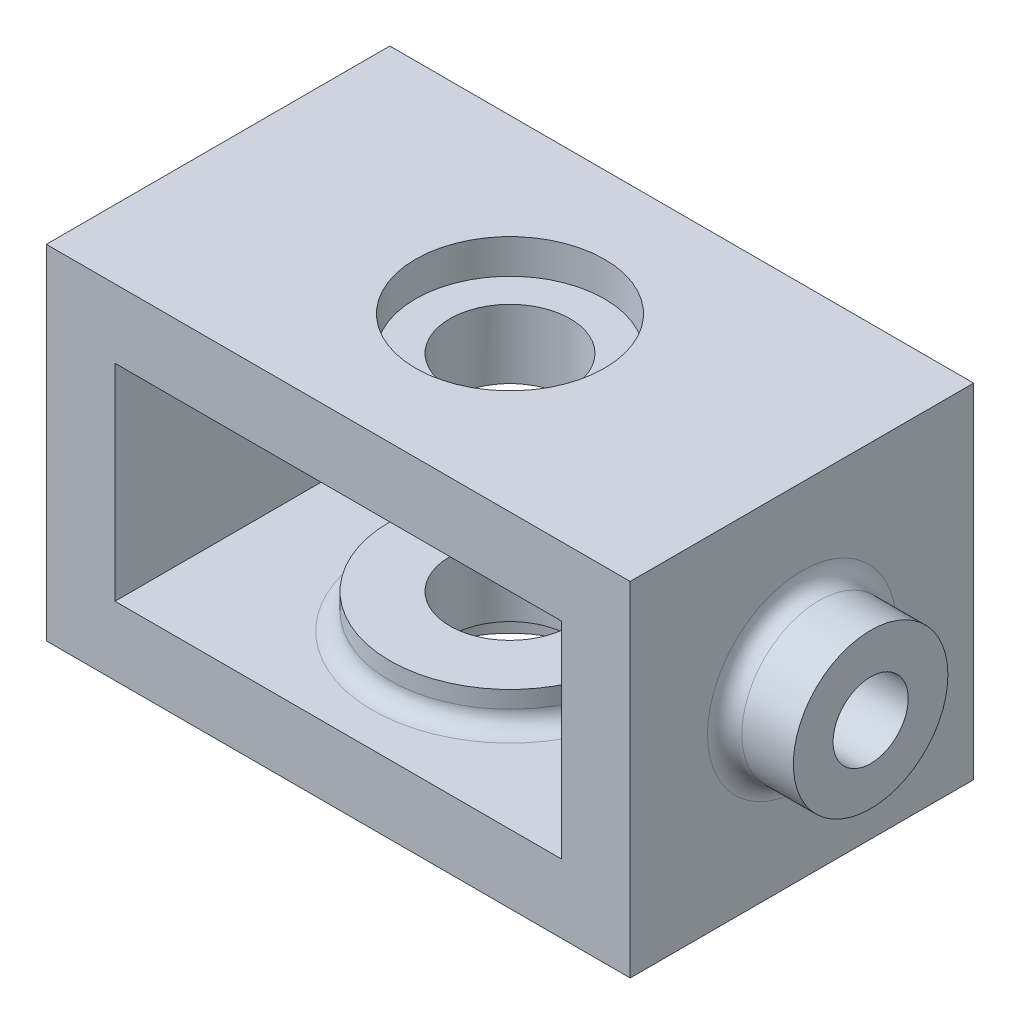
ISO-10303-21;
HEADER;
FILE_DESCRIPTION(('STEP AP214'),'2;1');
FILE_NAME('part.step','',(''),(''),'','','');
FILE_SCHEMA(('AUTOMOTIVE_DESIGN { 1 0 10303 214 1 1 1 1 }'));
ENDSEC;
DATA;
#1=APPLICATION_CONTEXT('core data for automotive mechanical design processes');
#2=APPLICATION_PROTOCOL_DEFINITION('international standard','automotive_design',2000,#1);
#3=PRODUCT_CONTEXT('',#1,'mechanical');
#4=PRODUCT('Part','Part','',(#3));
#5=PRODUCT_RELATED_PRODUCT_CATEGORY('part','',(#4));
#6=PRODUCT_DEFINITION_FORMATION('','',#4);
#7=PRODUCT_DEFINITION_CONTEXT('part definition',#1,'design');
#8=PRODUCT_DEFINITION('design','',#6,#7);
#9=PRODUCT_DEFINITION_SHAPE('','',#8);
#10=(LENGTH_UNIT() NAMED_UNIT(*) SI_UNIT(.MILLI.,.METRE.));
#11=(NAMED_UNIT(*) PLANE_ANGLE_UNIT() SI_UNIT($,.RADIAN.));
#12=(NAMED_UNIT(*) SI_UNIT($,.STERADIAN.) SOLID_ANGLE_UNIT());
#13=UNCERTAINTY_MEASURE_WITH_UNIT(LENGTH_MEASURE(1.E-05),#10,'distance_accuracy_value','');
#14=(GEOMETRIC_REPRESENTATION_CONTEXT(3) GLOBAL_UNCERTAINTY_ASSIGNED_CONTEXT((#13)) GLOBAL_UNIT_ASSIGNED_CONTEXT((#10,
#11,#12)) REPRESENTATION_CONTEXT('',''));
#15=CARTESIAN_POINT('',(0.,0.,0.));
#16=DIRECTION('',(0.,0.,1.));
#17=DIRECTION('',(1.,0.,0.));
#18=AXIS2_PLACEMENT_3D('',#15,#16,#17);
#19=CARTESIAN_POINT('',(-43.18,0.,25.4));
#20=DIRECTION('',(0.,1.,0.));
#21=DIRECTION('',(0.,0.,1.));
#22=AXIS2_PLACEMENT_3D('',#19,#20,#21);
#23=CYLINDRICAL_SURFACE('',#22,8.88999999999999);
#24=CARTESIAN_POINT('',(-43.18,5.08,25.4));
#25=DIRECTION('',(0.,-1.,0.));
#26=DIRECTION('',(0.,0.,-1.));
#27=AXIS2_PLACEMENT_3D('',#24,#25,#26);
#28=CIRCLE('',#27,8.88999999999999);
#29=CARTESIAN_POINT('',(-43.18,5.08,16.51));
#30=VERTEX_POINT('',#29);
#31=EDGE_CURVE('E224',#30,#30,#28,.F.);
#32=ORIENTED_EDGE('',*,*,#31,.F.);
#33=EDGE_LOOP('',(#32));
#34=FACE_BOUND('',#33,.T.);
#35=CARTESIAN_POINT('',(-43.18,15.24,25.4));
#36=DIRECTION('',(0.,1.,0.));
#37=DIRECTION('',(-1.,0.,0.));
#38=AXIS2_PLACEMENT_3D('',#35,#36,#37);
#39=CIRCLE('',#38,8.88999999999999);
#40=CARTESIAN_POINT('',(-52.07,15.24,25.4));
#41=VERTEX_POINT('',#40);
#42=EDGE_CURVE('E234',#41,#41,#39,.T.);
#43=ORIENTED_EDGE('',*,*,#42,.T.);
#44=EDGE_LOOP('',(#43));
#45=FACE_BOUND('',#44,.T.);
#46=ADVANCED_FACE('F39',(#34,#45),#23,.F.);
#47=CARTESIAN_POINT('',(-86.36,25.4,25.4));
#48=DIRECTION('',(1.,0.,0.));
#49=DIRECTION('',(0.,0.,-1.));
#50=AXIS2_PLACEMENT_3D('',#47,#48,#49);
#51=CYLINDRICAL_SURFACE('',#50,5.55625);
#52=CARTESIAN_POINT('',(10.16,25.4,25.4));
#53=DIRECTION('',(1.,0.,0.));
#54=DIRECTION('',(0.,0.,-1.));
#55=AXIS2_PLACEMENT_3D('',#52,#53,#54);
#56=CIRCLE('',#55,5.55625);
#57=CARTESIAN_POINT('',(10.16,25.4,19.84375));
#58=VERTEX_POINT('',#57);
#59=EDGE_CURVE('E167',#58,#58,#56,.T.);
#60=ORIENTED_EDGE('',*,*,#59,.T.);
#61=EDGE_LOOP('',(#60));
#62=FACE_BOUND('',#61,.T.);
#63=CARTESIAN_POINT('',(-10.16,25.4,25.4));
#64=DIRECTION('',(-1.,0.,0.));
#65=DIRECTION('',(0.,-1.,0.));
#66=AXIS2_PLACEMENT_3D('',#63,#64,#65);
#67=CIRCLE('',#66,5.55625);
#68=CARTESIAN_POINT('',(-10.16,19.84375,25.4));
#69=VERTEX_POINT('',#68);
#70=EDGE_CURVE('E152',#69,#69,#67,.F.);
#71=ORIENTED_EDGE('',*,*,#70,.F.);
#72=EDGE_LOOP('',(#71));
#73=FACE_BOUND('',#72,.T.);
#74=ADVANCED_FACE('F274',(#62,#73),#51,.F.);
#75=CARTESIAN_POINT('',(-86.36,0.,50.8));
#76=DIRECTION('',(0.,1.,0.));
#77=DIRECTION('',(0.,0.,1.));
#78=AXIS2_PLACEMENT_3D('',#75,#76,#77);
#79=PLANE('',#78);
#80=CARTESIAN_POINT('',(-43.18,0.,25.4));
#81=DIRECTION('',(0.,-1.,0.));
#82=DIRECTION('',(0.,0.,-1.));
#83=AXIS2_PLACEMENT_3D('',#80,#81,#82);
#84=CIRCLE('',#83,13.97);
#85=CARTESIAN_POINT('',(-43.18,0.,11.43));
#86=VERTEX_POINT('',#85);
#87=EDGE_CURVE('E323',#86,#86,#84,.T.);
#88=ORIENTED_EDGE('',*,*,#87,.F.);
#89=EDGE_LOOP('',(#88));
#90=FACE_BOUND('',#89,.T.);
#91=DIRECTION('',(1.,0.,0.));
#92=VECTOR('',#91,1.);
#93=CARTESIAN_POINT('',(-86.36,0.,0.));
#94=LINE('',#93,#92);
#95=CARTESIAN_POINT('',(-86.36,0.,0.));
#96=VERTEX_POINT('',#95);
#97=CARTESIAN_POINT('',(0.,0.,0.));
#98=VERTEX_POINT('',#97);
#99=EDGE_CURVE('E175',#96,#98,#94,.T.);
#100=ORIENTED_EDGE('',*,*,#99,.T.);
#101=DIRECTION('',(0.,0.,-1.));
#102=VECTOR('',#101,1.);
#103=CARTESIAN_POINT('',(0.,0.,50.8));
#104=LINE('',#103,#102);
#105=CARTESIAN_POINT('',(0.,0.,50.8));
#106=VERTEX_POINT('',#105);
#107=EDGE_CURVE('E214',#106,#98,#104,.T.);
#108=ORIENTED_EDGE('',*,*,#107,.F.);
#109=DIRECTION('',(1.,0.,0.));
#110=VECTOR('',#109,1.);
#111=CARTESIAN_POINT('',(-86.36,0.,50.8));
#112=LINE('',#111,#110);
#113=CARTESIAN_POINT('',(-86.36,0.,50.8));
#114=VERTEX_POINT('',#113);
#115=EDGE_CURVE('E176',#114,#106,#112,.T.);
#116=ORIENTED_EDGE('',*,*,#115,.F.);
#117=DIRECTION('',(0.,0.,-1.));
#118=VECTOR('',#117,1.);
#119=CARTESIAN_POINT('',(-86.36,0.,50.8));
#120=LINE('',#119,#118);
#121=EDGE_CURVE('E191',#114,#96,#120,.T.);
#122=ORIENTED_EDGE('',*,*,#121,.T.);
#123=EDGE_LOOP('',(#100,#108,#116,#122));
#124=FACE_BOUND('',#123,.T.);
#125=ADVANCED_FACE('F281',(#90,#124),#79,.F.);
#126=CARTESIAN_POINT('',(0.,50.8,50.8));
#127=DIRECTION('',(1.,0.,0.));
#128=DIRECTION('',(0.,0.,-1.));
#129=AXIS2_PLACEMENT_3D('',#126,#127,#128);
#130=PLANE('',#129);
#131=CARTESIAN_POINT('',(0.,25.4940503239926,25.4));
#132=DIRECTION('',(1.,0.,0.));
#133=DIRECTION('',(0.,0.,-1.));
#134=AXIS2_PLACEMENT_3D('',#131,#132,#133);
#135=CIRCLE('',#134,13.97);
#136=CARTESIAN_POINT('',(0.,25.4940503239926,11.43));
#137=VERTEX_POINT('',#136);
#138=EDGE_CURVE('E254',#137,#137,#135,.F.);
#139=ORIENTED_EDGE('',*,*,#138,.T.);
#140=EDGE_LOOP('',(#139));
#141=FACE_BOUND('',#140,.T.);
#142=DIRECTION('',(0.,-1.,0.));
#143=VECTOR('',#142,1.);
#144=CARTESIAN_POINT('',(0.,50.8,0.));
#145=LINE('',#144,#143);
#146=CARTESIAN_POINT('',(0.,50.8,0.));
#147=VERTEX_POINT('',#146);
#148=EDGE_CURVE('E195',#147,#98,#145,.T.);
#149=ORIENTED_EDGE('',*,*,#148,.F.);
#150=DIRECTION('',(0.,0.,-1.));
#151=VECTOR('',#150,1.);
#152=CARTESIAN_POINT('',(0.,50.8,50.8));
#153=LINE('',#152,#151);
#154=CARTESIAN_POINT('',(0.,50.8,50.8));
#155=VERTEX_POINT('',#154);
#156=EDGE_CURVE('E211',#155,#147,#153,.T.);
#157=ORIENTED_EDGE('',*,*,#156,.F.);
#158=DIRECTION('',(0.,-1.,0.));
#159=VECTOR('',#158,1.);
#160=CARTESIAN_POINT('',(0.,50.8,50.8));
#161=LINE('',#160,#159);
#162=EDGE_CURVE('E179',#155,#106,#161,.T.);
#163=ORIENTED_EDGE('',*,*,#162,.T.);
#164=ORIENTED_EDGE('',*,*,#107,.T.);
#165=EDGE_LOOP('',(#149,#157,#163,#164));
#166=FACE_BOUND('',#165,.T.);
#167=ADVANCED_FACE('F348',(#141,#166),#130,.T.);
#168=CARTESIAN_POINT('',(-86.36,50.8,50.8));
#169=DIRECTION('',(0.,1.,0.));
#170=DIRECTION('',(0.,0.,1.));
#171=AXIS2_PLACEMENT_3D('',#168,#169,#170);
#172=PLANE('',#171);
#173=CARTESIAN_POINT('',(-43.18,50.8,25.4));
#174=DIRECTION('',(0.,1.,0.));
#175=DIRECTION('',(0.,0.,1.));
#176=AXIS2_PLACEMENT_3D('',#173,#174,#175);
#177=CIRCLE('',#176,13.97);
#178=CARTESIAN_POINT('',(-43.18,50.8,39.37));
#179=VERTEX_POINT('',#178);
#180=EDGE_CURVE('E133',#179,#179,#177,.T.);
#181=ORIENTED_EDGE('',*,*,#180,.F.);
#182=EDGE_LOOP('',(#181));
#183=FACE_BOUND('',#182,.T.);
#184=DIRECTION('',(1.,0.,0.));
#185=VECTOR('',#184,1.);
#186=CARTESIAN_POINT('',(-86.36,50.8,0.));
#187=LINE('',#186,#185);
#188=CARTESIAN_POINT('',(-86.36,50.8,0.));
#189=VERTEX_POINT('',#188);
#190=EDGE_CURVE('E199',#189,#147,#187,.T.);
#191=ORIENTED_EDGE('',*,*,#190,.F.);
#192=DIRECTION('',(0.,0.,-1.));
#193=VECTOR('',#192,1.);
#194=CARTESIAN_POINT('',(-86.36,50.8,50.8));
#195=LINE('',#194,#193);
#196=CARTESIAN_POINT('',(-86.36,50.8,50.8));
#197=VERTEX_POINT('',#196);
#198=EDGE_CURVE('E208',#197,#189,#195,.T.);
#199=ORIENTED_EDGE('',*,*,#198,.F.);
#200=DIRECTION('',(1.,0.,0.));
#201=VECTOR('',#200,1.);
#202=CARTESIAN_POINT('',(-86.36,50.8,50.8));
#203=LINE('',#202,#201);
#204=EDGE_CURVE('E184',#197,#155,#203,.T.);
#205=ORIENTED_EDGE('',*,*,#204,.T.);
#206=ORIENTED_EDGE('',*,*,#156,.T.);
#207=EDGE_LOOP('',(#191,#199,#205,#206));
#208=FACE_BOUND('',#207,.T.);
#209=ADVANCED_FACE('F344',(#183,#208),#172,.T.);
#210=CARTESIAN_POINT('',(-86.36,50.8,50.8));
#211=DIRECTION('',(1.,0.,0.));
#212=DIRECTION('',(0.,0.,-1.));
#213=AXIS2_PLACEMENT_3D('',#210,#211,#212);
#214=PLANE('',#213);
#215=CARTESIAN_POINT('',(-86.36,25.4,25.4));
#216=DIRECTION('',(1.,0.,0.));
#217=DIRECTION('',(0.,0.,-1.));
#218=AXIS2_PLACEMENT_3D('',#215,#216,#217);
#219=CIRCLE('',#218,13.97);
#220=CARTESIAN_POINT('',(-86.36,25.4,11.43));
#221=VERTEX_POINT('',#220);
#222=EDGE_CURVE('E238',#221,#221,#219,.T.);
#223=ORIENTED_EDGE('',*,*,#222,.T.);
#224=EDGE_LOOP('',(#223));
#225=FACE_BOUND('',#224,.T.);
#226=DIRECTION('',(0.,-1.,0.));
#227=VECTOR('',#226,1.);
#228=CARTESIAN_POINT('',(-86.36,50.8,0.));
#229=LINE('',#228,#227);
#230=EDGE_CURVE('E180',#189,#96,#229,.T.);
#231=ORIENTED_EDGE('',*,*,#230,.T.);
#232=ORIENTED_EDGE('',*,*,#121,.F.);
#233=DIRECTION('',(0.,-1.,0.));
#234=VECTOR('',#233,1.);
#235=CARTESIAN_POINT('',(-86.36,50.8,50.8));
#236=LINE('',#235,#234);
#237=EDGE_CURVE('E188',#197,#114,#236,.T.);
#238=ORIENTED_EDGE('',*,*,#237,.F.);
#239=ORIENTED_EDGE('',*,*,#198,.T.);
#240=EDGE_LOOP('',(#231,#232,#238,#239));
#241=FACE_BOUND('',#240,.T.);
#242=ADVANCED_FACE('F347',(#225,#241),#214,.F.);
#243=CARTESIAN_POINT('',(0.,0.,50.8));
#244=DIRECTION('',(0.,0.,-1.));
#245=DIRECTION('',(-1.,0.,0.));
#246=AXIS2_PLACEMENT_3D('',#243,#244,#245);
#247=PLANE('',#246);
#248=DIRECTION('',(0.,-1.,0.));
#249=VECTOR('',#248,1.);
#250=CARTESIAN_POINT('',(-10.16,40.64,50.8));
#251=LINE('',#250,#249);
#252=CARTESIAN_POINT('',(-10.16,40.64,50.8));
#253=VERTEX_POINT('',#252);
#254=CARTESIAN_POINT('',(-10.16,10.16,50.8));
#255=VERTEX_POINT('',#254);
#256=EDGE_CURVE('E142',#253,#255,#251,.T.);
#257=ORIENTED_EDGE('',*,*,#256,.T.);
#258=DIRECTION('',(1.,0.,0.));
#259=VECTOR('',#258,1.);
#260=CARTESIAN_POINT('',(-76.2,10.16,50.8));
#261=LINE('',#260,#259);
#262=CARTESIAN_POINT('',(-76.2,10.16,50.8));
#263=VERTEX_POINT('',#262);
#264=EDGE_CURVE('E55',#263,#255,#261,.T.);
#265=ORIENTED_EDGE('',*,*,#264,.F.);
#266=DIRECTION('',(0.,-1.,0.));
#267=VECTOR('',#266,1.);
#268=CARTESIAN_POINT('',(-76.2,40.64,50.8));
#269=LINE('',#268,#267);
#270=CARTESIAN_POINT('',(-76.2,40.64,50.8));
#271=VERTEX_POINT('',#270);
#272=EDGE_CURVE('E126',#271,#263,#269,.T.);
#273=ORIENTED_EDGE('',*,*,#272,.F.);
#274=DIRECTION('',(1.,0.,0.));
#275=VECTOR('',#274,1.);
#276=CARTESIAN_POINT('',(-76.2,40.64,50.8));
#277=LINE('',#276,#275);
#278=EDGE_CURVE('E130',#271,#253,#277,.T.);
#279=ORIENTED_EDGE('',*,*,#278,.T.);
#280=EDGE_LOOP('',(#257,#265,#273,#279));
#281=FACE_BOUND('',#280,.T.);
#282=ORIENTED_EDGE('',*,*,#115,.T.);
#283=ORIENTED_EDGE('',*,*,#162,.F.);
#284=ORIENTED_EDGE('',*,*,#204,.F.);
#285=ORIENTED_EDGE('',*,*,#237,.T.);
#286=EDGE_LOOP('',(#282,#283,#284,#285));
#287=FACE_BOUND('',#286,.T.);
#288=ADVANCED_FACE('F362',(#281,#287),#247,.F.);
#289=CARTESIAN_POINT('',(0.,0.,0.));
#290=DIRECTION('',(0.,0.,-1.));
#291=DIRECTION('',(-1.,0.,0.));
#292=AXIS2_PLACEMENT_3D('',#289,#290,#291);
#293=PLANE('',#292);
#294=DIRECTION('',(1.,0.,0.));
#295=VECTOR('',#294,1.);
#296=CARTESIAN_POINT('',(-76.2,10.16,0.));
#297=LINE('',#296,#295);
#298=CARTESIAN_POINT('',(-76.2,10.16,0.));
#299=VERTEX_POINT('',#298);
#300=CARTESIAN_POINT('',(-10.16,10.16,0.));
#301=VERTEX_POINT('',#300);
#302=EDGE_CURVE('E114',#299,#301,#297,.T.);
#303=ORIENTED_EDGE('',*,*,#302,.T.);
#304=DIRECTION('',(0.,-1.,0.));
#305=VECTOR('',#304,1.);
#306=CARTESIAN_POINT('',(-10.16,40.64,0.));
#307=LINE('',#306,#305);
#308=CARTESIAN_POINT('',(-10.16,40.64,0.));
#309=VERTEX_POINT('',#308);
#310=EDGE_CURVE('E104',#309,#301,#307,.T.);
#311=ORIENTED_EDGE('',*,*,#310,.F.);
#312=DIRECTION('',(1.,0.,0.));
#313=VECTOR('',#312,1.);
#314=CARTESIAN_POINT('',(-76.2,40.64,0.));
#315=LINE('',#314,#313);
#316=CARTESIAN_POINT('',(-76.2,40.64,0.));
#317=VERTEX_POINT('',#316);
#318=EDGE_CURVE('E113',#317,#309,#315,.T.);
#319=ORIENTED_EDGE('',*,*,#318,.F.);
#320=DIRECTION('',(0.,-1.,0.));
#321=VECTOR('',#320,1.);
#322=CARTESIAN_POINT('',(-76.2,40.64,0.));
#323=LINE('',#322,#321);
#324=EDGE_CURVE('E120',#317,#299,#323,.T.);
#325=ORIENTED_EDGE('',*,*,#324,.T.);
#326=EDGE_LOOP('',(#303,#311,#319,#325));
#327=FACE_BOUND('',#326,.T.);
#328=ORIENTED_EDGE('',*,*,#99,.F.);
#329=ORIENTED_EDGE('',*,*,#230,.F.);
#330=ORIENTED_EDGE('',*,*,#190,.T.);
#331=ORIENTED_EDGE('',*,*,#148,.T.);
#332=EDGE_LOOP('',(#328,#329,#330,#331));
#333=FACE_BOUND('',#332,.T.);
#334=ADVANCED_FACE('F122',(#327,#333),#293,.T.);
#335=CARTESIAN_POINT('',(-76.2,25.4,25.4));
#336=DIRECTION('',(-1.,0.,0.));
#337=DIRECTION('',(0.,0.,1.));
#338=AXIS2_PLACEMENT_3D('',#335,#336,#337);
#339=CIRCLE('',#338,5.55625);
#340=CARTESIAN_POINT('',(-76.2,25.4,30.95625));
#341=VERTEX_POINT('',#340);
#342=EDGE_CURVE('E163',#341,#341,#339,.F.);
#343=ORIENTED_EDGE('',*,*,#342,.T.);
#344=EDGE_LOOP('',(#343));
#345=FACE_BOUND('',#344,.T.);
#346=CARTESIAN_POINT('',(-96.52,25.4,25.4));
#347=DIRECTION('',(-1.,0.,0.));
#348=DIRECTION('',(0.,0.,1.));
#349=AXIS2_PLACEMENT_3D('',#346,#347,#348);
#350=CIRCLE('',#349,5.55625);
#351=CARTESIAN_POINT('',(-96.52,25.4,30.95625));
#352=VERTEX_POINT('',#351);
#353=EDGE_CURVE('E158',#352,#352,#350,.T.);
#354=ORIENTED_EDGE('',*,*,#353,.T.);
#355=EDGE_LOOP('',(#354));
#356=FACE_BOUND('',#355,.T.);
#357=ADVANCED_FACE('F284',(#345,#356),#51,.F.);
#358=CARTESIAN_POINT('',(10.16,25.4940503239926,25.4));
#359=DIRECTION('',(-1.,0.,0.));
#360=DIRECTION('',(0.,0.,1.));
#361=AXIS2_PLACEMENT_3D('',#358,#359,#360);
#362=CYLINDRICAL_SURFACE('',#361,11.43);
#363=CARTESIAN_POINT('',(2.54,25.4940503239926,25.4));
#364=DIRECTION('',(1.,0.,0.));
#365=DIRECTION('',(0.,0.,-1.));
#366=AXIS2_PLACEMENT_3D('',#363,#364,#365);
#367=CIRCLE('',#366,11.43);
#368=CARTESIAN_POINT('',(2.54,25.4940503239926,13.97));
#369=VERTEX_POINT('',#368);
#370=EDGE_CURVE('E250',#369,#369,#367,.T.);
#371=ORIENTED_EDGE('',*,*,#370,.T.);
#372=EDGE_LOOP('',(#371));
#373=FACE_BOUND('',#372,.T.);
#374=CARTESIAN_POINT('',(10.16,25.4940503239926,25.4));
#375=DIRECTION('',(1.,0.,0.));
#376=DIRECTION('',(0.,0.,-1.));
#377=AXIS2_PLACEMENT_3D('',#374,#375,#376);
#378=CIRCLE('',#377,11.43);
#379=CARTESIAN_POINT('',(10.16,25.4940503239926,13.97));
#380=VERTEX_POINT('',#379);
#381=EDGE_CURVE('E171',#380,#380,#378,.T.);
#382=ORIENTED_EDGE('',*,*,#381,.F.);
#383=EDGE_LOOP('',(#382));
#384=FACE_BOUND('',#383,.T.);
#385=ADVANCED_FACE('F473',(#373,#384),#362,.T.);
#386=CARTESIAN_POINT('',(10.16,25.4940503239926,25.4));
#387=DIRECTION('',(1.,0.,0.));
#388=DIRECTION('',(0.,0.,-1.));
#389=AXIS2_PLACEMENT_3D('',#386,#387,#388);
#390=PLANE('',#389);
#391=ORIENTED_EDGE('',*,*,#59,.F.);
#392=EDGE_LOOP('',(#391));
#393=FACE_BOUND('',#392,.T.);
#394=ORIENTED_EDGE('',*,*,#381,.T.);
#395=EDGE_LOOP('',(#394));
#396=FACE_BOUND('',#395,.T.);
#397=ADVANCED_FACE('F478',(#393,#396),#390,.T.);
#398=CARTESIAN_POINT('',(-96.52,25.4,25.4));
#399=DIRECTION('',(1.,0.,0.));
#400=DIRECTION('',(0.,0.,-1.));
#401=AXIS2_PLACEMENT_3D('',#398,#399,#400);
#402=CYLINDRICAL_SURFACE('',#401,11.43);
#403=CARTESIAN_POINT('',(-88.9,25.4,25.4));
#404=DIRECTION('',(1.,0.,0.));
#405=DIRECTION('',(0.,0.,-1.));
#406=AXIS2_PLACEMENT_3D('',#403,#404,#405);
#407=CIRCLE('',#406,11.43);
#408=CARTESIAN_POINT('',(-88.9,25.4,13.97));
#409=VERTEX_POINT('',#408);
#410=EDGE_CURVE('E217',#409,#409,#407,.F.);
#411=ORIENTED_EDGE('',*,*,#410,.T.);
#412=EDGE_LOOP('',(#411));
#413=FACE_BOUND('',#412,.T.);
#414=CARTESIAN_POINT('',(-96.52,25.4,25.4));
#415=DIRECTION('',(-1.,0.,0.));
#416=DIRECTION('',(0.,0.,1.));
#417=AXIS2_PLACEMENT_3D('',#414,#415,#416);
#418=CIRCLE('',#417,11.43);
#419=CARTESIAN_POINT('',(-96.52,25.4,36.83));
#420=VERTEX_POINT('',#419);
#421=EDGE_CURVE('E162',#420,#420,#418,.T.);
#422=ORIENTED_EDGE('',*,*,#421,.F.);
#423=EDGE_LOOP('',(#422));
#424=FACE_BOUND('',#423,.T.);
#425=ADVANCED_FACE('F488',(#413,#424),#402,.T.);
#426=CARTESIAN_POINT('',(-96.52,25.4,25.4));
#427=DIRECTION('',(-1.,0.,0.));
#428=DIRECTION('',(0.,0.,1.));
#429=AXIS2_PLACEMENT_3D('',#426,#427,#428);
#430=PLANE('',#429);
#431=ORIENTED_EDGE('',*,*,#353,.F.);
#432=EDGE_LOOP('',(#431));
#433=FACE_BOUND('',#432,.T.);
#434=ORIENTED_EDGE('',*,*,#421,.T.);
#435=EDGE_LOOP('',(#434));
#436=FACE_BOUND('',#435,.T.);
#437=ADVANCED_FACE('F492',(#433,#436),#430,.T.);
#438=CARTESIAN_POINT('',(-76.2,40.64,0.));
#439=DIRECTION('',(-1.,0.,0.));
#440=DIRECTION('',(0.,0.,1.));
#441=AXIS2_PLACEMENT_3D('',#438,#439,#440);
#442=PLANE('',#441);
#443=ORIENTED_EDGE('',*,*,#272,.T.);
#444=DIRECTION('',(0.,0.,1.));
#445=VECTOR('',#444,1.);
#446=CARTESIAN_POINT('',(-76.2,10.16,0.));
#447=LINE('',#446,#445);
#448=EDGE_CURVE('E149',#299,#263,#447,.T.);
#449=ORIENTED_EDGE('',*,*,#448,.F.);
#450=ORIENTED_EDGE('',*,*,#324,.F.);
#451=DIRECTION('',(0.,0.,1.));
#452=VECTOR('',#451,1.);
#453=CARTESIAN_POINT('',(-76.2,40.64,0.));
#454=LINE('',#453,#452);
#455=EDGE_CURVE('E153',#317,#271,#454,.T.);
#456=ORIENTED_EDGE('',*,*,#455,.T.);
#457=EDGE_LOOP('',(#443,#449,#450,#456));
#458=FACE_BOUND('',#457,.T.);
#459=ORIENTED_EDGE('',*,*,#342,.F.);
#460=EDGE_LOOP('',(#459));
#461=FACE_BOUND('',#460,.T.);
#462=ADVANCED_FACE('F591',(#458,#461),#442,.F.);
#463=CARTESIAN_POINT('',(-10.16,40.64,0.));
#464=DIRECTION('',(-1.,0.,0.));
#465=DIRECTION('',(0.,-1.,0.));
#466=AXIS2_PLACEMENT_3D('',#463,#464,#465);
#467=PLANE('',#466);
#468=ORIENTED_EDGE('',*,*,#256,.F.);
#469=DIRECTION('',(0.,0.,1.));
#470=VECTOR('',#469,1.);
#471=CARTESIAN_POINT('',(-10.16,40.64,0.));
#472=LINE('',#471,#470);
#473=EDGE_CURVE('E63',#309,#253,#472,.T.);
#474=ORIENTED_EDGE('',*,*,#473,.F.);
#475=ORIENTED_EDGE('',*,*,#310,.T.);
#476=DIRECTION('',(0.,0.,1.));
#477=VECTOR('',#476,1.);
#478=CARTESIAN_POINT('',(-10.16,10.16,0.));
#479=LINE('',#478,#477);
#480=EDGE_CURVE('E107',#301,#255,#479,.T.);
#481=ORIENTED_EDGE('',*,*,#480,.T.);
#482=EDGE_LOOP('',(#468,#474,#475,#481));
#483=FACE_BOUND('',#482,.T.);
#484=ORIENTED_EDGE('',*,*,#70,.T.);
#485=EDGE_LOOP('',(#484));
#486=FACE_BOUND('',#485,.T.);
#487=ADVANCED_FACE('F105',(#483,#486),#467,.T.);
#488=CARTESIAN_POINT('',(-76.2,10.16,0.));
#489=DIRECTION('',(0.,-1.,0.));
#490=DIRECTION('',(1.,0.,0.));
#491=AXIS2_PLACEMENT_3D('',#488,#489,#490);
#492=PLANE('',#491);
#493=CARTESIAN_POINT('',(-43.18,10.16,25.4));
#494=DIRECTION('',(0.,-1.,0.));
#495=DIRECTION('',(1.,0.,0.));
#496=AXIS2_PLACEMENT_3D('',#493,#494,#495);
#497=CIRCLE('',#496,20.32);
#498=CARTESIAN_POINT('',(-22.86,10.16,25.4));
#499=VERTEX_POINT('',#498);
#500=EDGE_CURVE('E11',#499,#499,#497,.T.);
#501=ORIENTED_EDGE('',*,*,#500,.T.);
#502=EDGE_LOOP('',(#501));
#503=FACE_BOUND('',#502,.T.);
#504=ORIENTED_EDGE('',*,*,#264,.T.);
#505=ORIENTED_EDGE('',*,*,#480,.F.);
#506=ORIENTED_EDGE('',*,*,#302,.F.);
#507=ORIENTED_EDGE('',*,*,#448,.T.);
#508=EDGE_LOOP('',(#504,#505,#506,#507));
#509=FACE_BOUND('',#508,.T.);
#510=ADVANCED_FACE('F117',(#503,#509),#492,.F.);
#511=CARTESIAN_POINT('',(-76.2,40.64,0.));
#512=DIRECTION('',(0.,-1.,0.));
#513=DIRECTION('',(0.,0.,-1.));
#514=AXIS2_PLACEMENT_3D('',#511,#512,#513);
#515=PLANE('',#514);
#516=CARTESIAN_POINT('',(-43.18,40.64,25.4));
#517=DIRECTION('',(0.,-1.,0.));
#518=DIRECTION('',(0.,0.,-1.));
#519=AXIS2_PLACEMENT_3D('',#516,#517,#518);
#520=CIRCLE('',#519,20.32);
#521=CARTESIAN_POINT('',(-43.18,40.64,5.08));
#522=VERTEX_POINT('',#521);
#523=EDGE_CURVE('E246',#522,#522,#520,.F.);
#524=ORIENTED_EDGE('',*,*,#523,.T.);
#525=EDGE_LOOP('',(#524));
#526=FACE_BOUND('',#525,.T.);
#527=ORIENTED_EDGE('',*,*,#278,.F.);
#528=ORIENTED_EDGE('',*,*,#455,.F.);
#529=ORIENTED_EDGE('',*,*,#318,.T.);
#530=ORIENTED_EDGE('',*,*,#473,.T.);
#531=EDGE_LOOP('',(#527,#528,#529,#530));
#532=FACE_BOUND('',#531,.T.);
#533=ADVANCED_FACE('F421',(#526,#532),#515,.T.);
#534=CARTESIAN_POINT('',(-43.18,45.72,25.4));
#535=DIRECTION('',(0.,1.,0.));
#536=DIRECTION('',(0.,0.,1.));
#537=AXIS2_PLACEMENT_3D('',#534,#535,#536);
#538=CYLINDRICAL_SURFACE('',#537,13.97);
#539=CARTESIAN_POINT('',(-43.18,45.72,25.4));
#540=DIRECTION('',(0.,1.,0.));
#541=DIRECTION('',(0.,0.,1.));
#542=AXIS2_PLACEMENT_3D('',#539,#540,#541);
#543=CIRCLE('',#542,13.97);
#544=CARTESIAN_POINT('',(-43.18,45.72,39.37));
#545=VERTEX_POINT('',#544);
#546=EDGE_CURVE('E143',#545,#545,#543,.T.);
#547=ORIENTED_EDGE('',*,*,#546,.F.);
#548=EDGE_LOOP('',(#547));
#549=FACE_BOUND('',#548,.T.);
#550=ORIENTED_EDGE('',*,*,#180,.T.);
#551=EDGE_LOOP('',(#550));
#552=FACE_BOUND('',#551,.T.);
#553=ADVANCED_FACE('F300',(#549,#552),#538,.F.);
#554=CARTESIAN_POINT('',(-43.18,45.72,25.4));
#555=DIRECTION('',(0.,1.,0.));
#556=DIRECTION('',(0.,0.,1.));
#557=AXIS2_PLACEMENT_3D('',#554,#555,#556);
#558=PLANE('',#557);
#559=CARTESIAN_POINT('',(-43.18,45.72,25.4));
#560=DIRECTION('',(0.,1.,0.));
#561=DIRECTION('',(0.,0.,1.));
#562=AXIS2_PLACEMENT_3D('',#559,#560,#561);
#563=CIRCLE('',#562,8.88999999999999);
#564=CARTESIAN_POINT('',(-43.18,45.72,34.29));
#565=VERTEX_POINT('',#564);
#566=EDGE_CURVE('E228',#565,#565,#563,.T.);
#567=ORIENTED_EDGE('',*,*,#566,.F.);
#568=EDGE_LOOP('',(#567));
#569=FACE_BOUND('',#568,.T.);
#570=ORIENTED_EDGE('',*,*,#546,.T.);
#571=EDGE_LOOP('',(#570));
#572=FACE_BOUND('',#571,.T.);
#573=ADVANCED_FACE('F291',(#569,#572),#558,.T.);
#574=ORIENTED_EDGE('',*,*,#566,.T.);
#575=EDGE_LOOP('',(#574));
#576=FACE_BOUND('',#575,.T.);
#577=CARTESIAN_POINT('',(-43.18,35.56,25.4));
#578=DIRECTION('',(0.,-1.,0.));
#579=DIRECTION('',(0.,0.,-1.));
#580=AXIS2_PLACEMENT_3D('',#577,#578,#579);
#581=CIRCLE('',#580,8.88999999999999);
#582=CARTESIAN_POINT('',(-43.18,35.56,16.51));
#583=VERTEX_POINT('',#582);
#584=EDGE_CURVE('E230',#583,#583,#581,.T.);
#585=ORIENTED_EDGE('',*,*,#584,.T.);
#586=EDGE_LOOP('',(#585));
#587=FACE_BOUND('',#586,.T.);
#588=ADVANCED_FACE('F277',(#576,#587),#23,.F.);
#589=CARTESIAN_POINT('',(-43.18,5.08,25.4));
#590=DIRECTION('',(0.,-1.,0.));
#591=DIRECTION('',(0.,0.,-1.));
#592=AXIS2_PLACEMENT_3D('',#589,#590,#591);
#593=PLANE('',#592);
#594=CARTESIAN_POINT('',(-43.18,5.08,25.4));
#595=DIRECTION('',(0.,-1.,0.));
#596=DIRECTION('',(0.,0.,-1.));
#597=AXIS2_PLACEMENT_3D('',#594,#595,#596);
#598=CIRCLE('',#597,13.97);
#599=CARTESIAN_POINT('',(-43.18,5.08,11.43));
#600=VERTEX_POINT('',#599);
#601=EDGE_CURVE('E229',#600,#600,#598,.T.);
#602=ORIENTED_EDGE('',*,*,#601,.T.);
#603=EDGE_LOOP('',(#602));
#604=FACE_BOUND('',#603,.T.);
#605=ORIENTED_EDGE('',*,*,#31,.T.);
#606=EDGE_LOOP('',(#605));
#607=FACE_BOUND('',#606,.T.);
#608=ADVANCED_FACE('F290',(#604,#607),#593,.T.);
#609=CARTESIAN_POINT('',(-43.18,5.08,25.4));
#610=DIRECTION('',(0.,-1.,0.));
#611=DIRECTION('',(0.,0.,-1.));
#612=AXIS2_PLACEMENT_3D('',#609,#610,#611);
#613=CYLINDRICAL_SURFACE('',#612,13.97);
#614=ORIENTED_EDGE('',*,*,#601,.F.);
#615=EDGE_LOOP('',(#614));
#616=FACE_BOUND('',#615,.T.);
#617=ORIENTED_EDGE('',*,*,#87,.T.);
#618=EDGE_LOOP('',(#617));
#619=FACE_BOUND('',#618,.T.);
#620=ADVANCED_FACE('F297',(#616,#619),#613,.F.);
#621=CARTESIAN_POINT('',(-43.18,15.24,25.4));
#622=DIRECTION('',(0.,1.,0.));
#623=DIRECTION('',(-1.,0.,0.));
#624=AXIS2_PLACEMENT_3D('',#621,#622,#623);
#625=PLANE('',#624);
#626=ORIENTED_EDGE('',*,*,#42,.F.);
#627=EDGE_LOOP('',(#626));
#628=FACE_BOUND('',#627,.T.);
#629=CARTESIAN_POINT('',(-43.18,15.24,25.4));
#630=DIRECTION('',(0.,1.,0.));
#631=DIRECTION('',(-1.,0.,0.));
#632=AXIS2_PLACEMENT_3D('',#629,#630,#631);
#633=CIRCLE('',#632,17.78);
#634=CARTESIAN_POINT('',(-60.96,15.24,25.4));
#635=VERTEX_POINT('',#634);
#636=EDGE_CURVE('E318',#635,#635,#633,.T.);
#637=ORIENTED_EDGE('',*,*,#636,.T.);
#638=EDGE_LOOP('',(#637));
#639=FACE_BOUND('',#638,.T.);
#640=ADVANCED_FACE('F391',(#628,#639),#625,.T.);
#641=CARTESIAN_POINT('',(-43.18,15.24,25.4));
#642=DIRECTION('',(0.,-1.,0.));
#643=DIRECTION('',(1.,0.,0.));
#644=AXIS2_PLACEMENT_3D('',#641,#642,#643);
#645=CYLINDRICAL_SURFACE('',#644,17.78);
#646=CARTESIAN_POINT('',(-43.18,12.7,25.4));
#647=DIRECTION('',(0.,-1.,0.));
#648=DIRECTION('',(1.,0.,0.));
#649=AXIS2_PLACEMENT_3D('',#646,#647,#648);
#650=CIRCLE('',#649,17.78);
#651=CARTESIAN_POINT('',(-25.4,12.7,25.4));
#652=VERTEX_POINT('',#651);
#653=EDGE_CURVE('E48',#652,#652,#650,.F.);
#654=ORIENTED_EDGE('',*,*,#653,.T.);
#655=EDGE_LOOP('',(#654));
#656=FACE_BOUND('',#655,.T.);
#657=ORIENTED_EDGE('',*,*,#636,.F.);
#658=EDGE_LOOP('',(#657));
#659=FACE_BOUND('',#658,.T.);
#660=ADVANCED_FACE('F261',(#656,#659),#645,.T.);
#661=CARTESIAN_POINT('',(-43.18,35.56,25.4));
#662=DIRECTION('',(0.,1.,0.));
#663=DIRECTION('',(0.,0.,1.));
#664=AXIS2_PLACEMENT_3D('',#661,#662,#663);
#665=CYLINDRICAL_SURFACE('',#664,17.78);
#666=CARTESIAN_POINT('',(-43.18,38.1,25.4));
#667=DIRECTION('',(0.,-1.,0.));
#668=DIRECTION('',(0.,0.,-1.));
#669=AXIS2_PLACEMENT_3D('',#666,#667,#668);
#670=CIRCLE('',#669,17.78);
#671=CARTESIAN_POINT('',(-43.18,38.1,7.62));
#672=VERTEX_POINT('',#671);
#673=EDGE_CURVE('E242',#672,#672,#670,.T.);
#674=ORIENTED_EDGE('',*,*,#673,.T.);
#675=EDGE_LOOP('',(#674));
#676=FACE_BOUND('',#675,.T.);
#677=CARTESIAN_POINT('',(-43.18,35.56,25.4));
#678=DIRECTION('',(0.,-1.,0.));
#679=DIRECTION('',(0.,0.,-1.));
#680=AXIS2_PLACEMENT_3D('',#677,#678,#679);
#681=CIRCLE('',#680,17.78);
#682=CARTESIAN_POINT('',(-43.18,35.56,7.62));
#683=VERTEX_POINT('',#682);
#684=EDGE_CURVE('E315',#683,#683,#681,.T.);
#685=ORIENTED_EDGE('',*,*,#684,.F.);
#686=EDGE_LOOP('',(#685));
#687=FACE_BOUND('',#686,.T.);
#688=ADVANCED_FACE('F311',(#676,#687),#665,.T.);
#689=CARTESIAN_POINT('',(-43.18,35.56,25.4));
#690=DIRECTION('',(0.,-1.,0.));
#691=DIRECTION('',(0.,0.,-1.));
#692=AXIS2_PLACEMENT_3D('',#689,#690,#691);
#693=PLANE('',#692);
#694=ORIENTED_EDGE('',*,*,#584,.F.);
#695=EDGE_LOOP('',(#694));
#696=FACE_BOUND('',#695,.T.);
#697=ORIENTED_EDGE('',*,*,#684,.T.);
#698=EDGE_LOOP('',(#697));
#699=FACE_BOUND('',#698,.T.);
#700=ADVANCED_FACE('F307',(#696,#699),#693,.T.);
#701=CARTESIAN_POINT('',(-88.9,25.4,25.4));
#702=DIRECTION('',(1.,0.,0.));
#703=DIRECTION('',(0.,0.,-1.));
#704=AXIS2_PLACEMENT_3D('',#701,#702,#703);
#705=TOROIDAL_SURFACE('',#704,13.97,2.54);
#706=ORIENTED_EDGE('',*,*,#222,.F.);
#707=EDGE_LOOP('',(#706));
#708=FACE_BOUND('',#707,.T.);
#709=ORIENTED_EDGE('',*,*,#410,.F.);
#710=EDGE_LOOP('',(#709));
#711=FACE_BOUND('',#710,.T.);
#712=ADVANCED_FACE('F310',(#708,#711),#705,.F.);
#713=CARTESIAN_POINT('',(-43.18,38.1,25.4));
#714=DIRECTION('',(0.,-1.,0.));
#715=DIRECTION('',(0.,0.,-1.));
#716=AXIS2_PLACEMENT_3D('',#713,#714,#715);
#717=TOROIDAL_SURFACE('',#716,20.32,2.54);
#718=ORIENTED_EDGE('',*,*,#523,.F.);
#719=EDGE_LOOP('',(#718));
#720=FACE_BOUND('',#719,.T.);
#721=ORIENTED_EDGE('',*,*,#673,.F.);
#722=EDGE_LOOP('',(#721));
#723=FACE_BOUND('',#722,.T.);
#724=ADVANCED_FACE('F270',(#720,#723),#717,.F.);
#725=CARTESIAN_POINT('',(2.54,25.4940503239926,25.4));
#726=DIRECTION('',(1.,0.,0.));
#727=DIRECTION('',(0.,0.,-1.));
#728=AXIS2_PLACEMENT_3D('',#725,#726,#727);
#729=TOROIDAL_SURFACE('',#728,13.97,2.54);
#730=ORIENTED_EDGE('',*,*,#138,.F.);
#731=EDGE_LOOP('',(#730));
#732=FACE_BOUND('',#731,.T.);
#733=ORIENTED_EDGE('',*,*,#370,.F.);
#734=EDGE_LOOP('',(#733));
#735=FACE_BOUND('',#734,.T.);
#736=ADVANCED_FACE('F265',(#732,#735),#729,.F.);
#737=CARTESIAN_POINT('',(-43.18,12.7,25.4));
#738=DIRECTION('',(0.,-1.,0.));
#739=DIRECTION('',(1.,0.,0.));
#740=AXIS2_PLACEMENT_3D('',#737,#738,#739);
#741=TOROIDAL_SURFACE('',#740,20.32,2.54);
#742=ORIENTED_EDGE('',*,*,#500,.F.);
#743=EDGE_LOOP('',(#742));
#744=FACE_BOUND('',#743,.T.);
#745=ORIENTED_EDGE('',*,*,#653,.F.);
#746=EDGE_LOOP('',(#745));
#747=FACE_BOUND('',#746,.T.);
#748=ADVANCED_FACE('F41',(#744,#747),#741,.F.);
#749=CLOSED_SHELL('',(#46,#74,#125,#167,#209,#242,#288,#334,#357,#385,#397,#425,#437,#462,#487,
#510,#533,#553,#573,#588,#608,#620,#640,#660,#688,#700,#712,#724,#736,#748));
#750=MANIFOLD_SOLID_BREP('B2',#749);
#751=ADVANCED_BREP_SHAPE_REPRESENTATION('',(#18,#750),#14);
#752=SHAPE_DEFINITION_REPRESENTATION(#9,#751);
ENDSEC;
END-ISO-10303-21;
